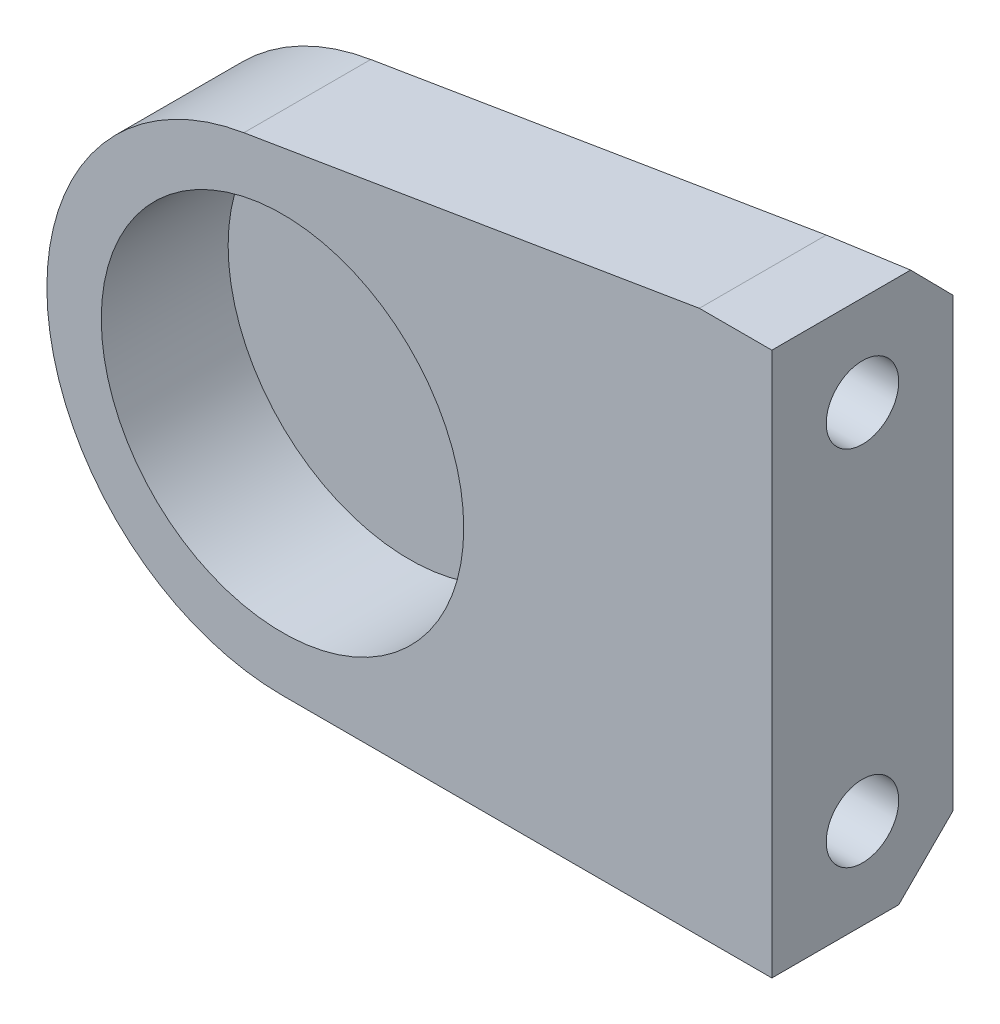
ISO-10303-21;
HEADER;
FILE_DESCRIPTION(('STEP AP214'),'2;1');
FILE_NAME('part.step','',(''),(''),'','','');
FILE_SCHEMA(('AUTOMOTIVE_DESIGN { 1 0 10303 214 1 1 1 1 }'));
ENDSEC;
DATA;
#1=APPLICATION_CONTEXT('core data for automotive mechanical design processes');
#2=APPLICATION_PROTOCOL_DEFINITION('international standard','automotive_design',2000,#1);
#3=PRODUCT_CONTEXT('',#1,'mechanical');
#4=PRODUCT('Part','Part','',(#3));
#5=PRODUCT_RELATED_PRODUCT_CATEGORY('part','',(#4));
#6=PRODUCT_DEFINITION_FORMATION('','',#4);
#7=PRODUCT_DEFINITION_CONTEXT('part definition',#1,'design');
#8=PRODUCT_DEFINITION('design','',#6,#7);
#9=PRODUCT_DEFINITION_SHAPE('','',#8);
#10=(LENGTH_UNIT() NAMED_UNIT(*) SI_UNIT(.MILLI.,.METRE.));
#11=(NAMED_UNIT(*) PLANE_ANGLE_UNIT() SI_UNIT($,.RADIAN.));
#12=(NAMED_UNIT(*) SI_UNIT($,.STERADIAN.) SOLID_ANGLE_UNIT());
#13=UNCERTAINTY_MEASURE_WITH_UNIT(LENGTH_MEASURE(1.E-05),#10,'distance_accuracy_value','');
#14=(GEOMETRIC_REPRESENTATION_CONTEXT(3) GLOBAL_UNCERTAINTY_ASSIGNED_CONTEXT((#13)) GLOBAL_UNIT_ASSIGNED_CONTEXT((#10,
#11,#12)) REPRESENTATION_CONTEXT('',''));
#15=CARTESIAN_POINT('',(0.,0.,0.));
#16=DIRECTION('',(0.,0.,1.));
#17=DIRECTION('',(1.,0.,0.));
#18=AXIS2_PLACEMENT_3D('',#15,#16,#17);
#19=CARTESIAN_POINT('',(0.,0.,5.));
#20=DIRECTION('',(0.,0.,-1.));
#21=DIRECTION('',(-1.,0.,0.));
#22=AXIS2_PLACEMENT_3D('',#19,#20,#21);
#23=CYLINDRICAL_SURFACE('',#22,6.5);
#24=DIRECTION('',(0.,0.,-1.));
#25=VECTOR('',#24,1.);
#26=CARTESIAN_POINT('',(-1.06545276752004,6.41208315605653,5.));
#27=LINE('',#26,#25);
#28=CARTESIAN_POINT('',(-1.06545276752004,6.41208315605653,5.));
#29=VERTEX_POINT('',#28);
#30=CARTESIAN_POINT('',(-1.06545276752004,6.41208315605653,1.5));
#31=VERTEX_POINT('',#30);
#32=EDGE_CURVE('E162',#29,#31,#27,.T.);
#33=ORIENTED_EDGE('',*,*,#32,.T.);
#34=CARTESIAN_POINT('',(0.,0.,1.5));
#35=DIRECTION('',(0.,0.,-1.));
#36=DIRECTION('',(-1.,0.,0.));
#37=AXIS2_PLACEMENT_3D('',#34,#35,#36);
#38=CIRCLE('',#37,6.5);
#39=CARTESIAN_POINT('',(0.,-6.5,1.5));
#40=VERTEX_POINT('',#39);
#41=EDGE_CURVE('E42',#31,#40,#38,.F.);
#42=ORIENTED_EDGE('',*,*,#41,.T.);
#43=DIRECTION('',(0.,0.,-1.));
#44=VECTOR('',#43,1.);
#45=CARTESIAN_POINT('',(0.,-6.5,5.));
#46=LINE('',#45,#44);
#47=CARTESIAN_POINT('',(0.,-6.5,5.));
#48=VERTEX_POINT('',#47);
#49=EDGE_CURVE('E94',#48,#40,#46,.T.);
#50=ORIENTED_EDGE('',*,*,#49,.F.);
#51=CARTESIAN_POINT('',(0.,0.,5.));
#52=DIRECTION('',(0.,0.,1.));
#53=DIRECTION('',(-1.,0.,0.));
#54=AXIS2_PLACEMENT_3D('',#51,#52,#53);
#55=CIRCLE('',#54,6.5);
#56=EDGE_CURVE('E99',#29,#48,#55,.T.);
#57=ORIENTED_EDGE('',*,*,#56,.F.);
#58=EDGE_LOOP('',(#33,#42,#50,#57));
#59=FACE_BOUND('',#58,.T.);
#60=ADVANCED_FACE('F33',(#59),#23,.T.);
#61=CARTESIAN_POINT('',(0.,-6.5,5.));
#62=DIRECTION('',(0.,1.,0.));
#63=DIRECTION('',(0.,0.,1.));
#64=AXIS2_PLACEMENT_3D('',#61,#62,#63);
#65=PLANE('',#64);
#66=ORIENTED_EDGE('',*,*,#49,.T.);
#67=DIRECTION('',(1.,0.,0.));
#68=VECTOR('',#67,1.);
#69=CARTESIAN_POINT('',(13.5,-6.5,1.5));
#70=LINE('',#69,#68);
#71=CARTESIAN_POINT('',(13.5,-6.5,1.50000000000001));
#72=VERTEX_POINT('',#71);
#73=EDGE_CURVE('E11',#40,#72,#70,.T.);
#74=ORIENTED_EDGE('',*,*,#73,.T.);
#75=DIRECTION('',(0.,0.,-1.));
#76=VECTOR('',#75,1.);
#77=CARTESIAN_POINT('',(13.5,-6.5,5.));
#78=LINE('',#77,#76);
#79=CARTESIAN_POINT('',(13.5,-6.5,5.));
#80=VERTEX_POINT('',#79);
#81=EDGE_CURVE('E95',#80,#72,#78,.T.);
#82=ORIENTED_EDGE('',*,*,#81,.F.);
#83=DIRECTION('',(1.,0.,0.));
#84=VECTOR('',#83,1.);
#85=CARTESIAN_POINT('',(0.,-6.5,5.));
#86=LINE('',#85,#84);
#87=EDGE_CURVE('E91',#48,#80,#86,.T.);
#88=ORIENTED_EDGE('',*,*,#87,.F.);
#89=EDGE_LOOP('',(#66,#74,#82,#88));
#90=FACE_BOUND('',#89,.T.);
#91=ADVANCED_FACE('F93',(#90),#65,.F.);
#92=CARTESIAN_POINT('',(13.5,-6.5,5.));
#93=DIRECTION('',(-1.,0.,0.));
#94=DIRECTION('',(0.,0.,1.));
#95=AXIS2_PLACEMENT_3D('',#92,#93,#94);
#96=PLANE('',#95);
#97=CARTESIAN_POINT('',(13.5,-4.,2.5));
#98=DIRECTION('',(1.,0.,0.));
#99=DIRECTION('',(0.,0.,1.));
#100=AXIS2_PLACEMENT_3D('',#97,#98,#99);
#101=CIRCLE('',#100,1.);
#102=CARTESIAN_POINT('',(13.5,-4.,3.5));
#103=VERTEX_POINT('',#102);
#104=EDGE_CURVE('E134',#103,#103,#101,.T.);
#105=ORIENTED_EDGE('',*,*,#104,.F.);
#106=EDGE_LOOP('',(#105));
#107=FACE_BOUND('',#106,.T.);
#108=CARTESIAN_POINT('',(13.5,6.,2.5));
#109=DIRECTION('',(1.,0.,0.));
#110=DIRECTION('',(0.,0.,-1.));
#111=AXIS2_PLACEMENT_3D('',#108,#109,#110);
#112=CIRCLE('',#111,1.);
#113=CARTESIAN_POINT('',(13.5,6.,1.5));
#114=VERTEX_POINT('',#113);
#115=EDGE_CURVE('E144',#114,#114,#112,.T.);
#116=ORIENTED_EDGE('',*,*,#115,.F.);
#117=EDGE_LOOP('',(#116));
#118=FACE_BOUND('',#117,.T.);
#119=DIRECTION('',(0.,1.,0.));
#120=VECTOR('',#119,1.);
#121=CARTESIAN_POINT('',(13.5,-6.5,0.));
#122=LINE('',#121,#120);
#123=CARTESIAN_POINT('',(13.5,-4.99999999999999,0.));
#124=VERTEX_POINT('',#123);
#125=CARTESIAN_POINT('',(13.5,7.31175987903972,0.));
#126=VERTEX_POINT('',#125);
#127=EDGE_CURVE('E106',#124,#126,#122,.T.);
#128=ORIENTED_EDGE('',*,*,#127,.T.);
#129=DIRECTION('',(0.,0.711904885384779,0.702275896044628));
#130=VECTOR('',#129,1.);
#131=CARTESIAN_POINT('',(13.5,8.66390061253409,1.33385212643956));
#132=LINE('',#131,#130);
#133=CARTESIAN_POINT('',(13.5,8.5,1.17216837922461));
#134=VERTEX_POINT('',#133);
#135=EDGE_CURVE('E124',#126,#134,#132,.T.);
#136=ORIENTED_EDGE('',*,*,#135,.T.);
#137=DIRECTION('',(0.,0.,-1.));
#138=VECTOR('',#137,1.);
#139=CARTESIAN_POINT('',(13.5,8.5,5.));
#140=LINE('',#139,#138);
#141=CARTESIAN_POINT('',(13.5,8.5,5.));
#142=VERTEX_POINT('',#141);
#143=EDGE_CURVE('E113',#142,#134,#140,.T.);
#144=ORIENTED_EDGE('',*,*,#143,.F.);
#145=DIRECTION('',(0.,1.,0.));
#146=VECTOR('',#145,1.);
#147=CARTESIAN_POINT('',(13.5,-6.5,5.));
#148=LINE('',#147,#146);
#149=EDGE_CURVE('E98',#80,#142,#148,.T.);
#150=ORIENTED_EDGE('',*,*,#149,.F.);
#151=ORIENTED_EDGE('',*,*,#81,.T.);
#152=DIRECTION('',(0.,0.707106781186548,-0.707106781186547));
#153=VECTOR('',#152,1.);
#154=CARTESIAN_POINT('',(13.5,-6.5,1.5));
#155=LINE('',#154,#153);
#156=EDGE_CURVE('E122',#72,#124,#155,.T.);
#157=ORIENTED_EDGE('',*,*,#156,.T.);
#158=EDGE_LOOP('',(#128,#136,#144,#150,#151,#157));
#159=FACE_BOUND('',#158,.T.);
#160=ADVANCED_FACE('F189',(#107,#118,#159),#96,.F.);
#161=CARTESIAN_POINT('',(13.5,8.5,5.));
#162=DIRECTION('',(0.,-1.,0.));
#163=DIRECTION('',(0.,0.,-1.));
#164=AXIS2_PLACEMENT_3D('',#161,#162,#163);
#165=PLANE('',#164);
#166=ORIENTED_EDGE('',*,*,#143,.T.);
#167=DIRECTION('',(-0.986830597713905,0.,0.161757137139652));
#168=VECTOR('',#167,1.);
#169=CARTESIAN_POINT('',(11.5,8.5,1.5));
#170=LINE('',#169,#168);
#171=CARTESIAN_POINT('',(11.5,8.5,1.5));
#172=VERTEX_POINT('',#171);
#173=EDGE_CURVE('E126',#134,#172,#170,.T.);
#174=ORIENTED_EDGE('',*,*,#173,.T.);
#175=DIRECTION('',(0.,0.,-1.));
#176=VECTOR('',#175,1.);
#177=CARTESIAN_POINT('',(11.5,8.5,5.));
#178=LINE('',#177,#176);
#179=CARTESIAN_POINT('',(11.5,8.5,5.));
#180=VERTEX_POINT('',#179);
#181=EDGE_CURVE('E166',#180,#172,#178,.T.);
#182=ORIENTED_EDGE('',*,*,#181,.F.);
#183=DIRECTION('',(-1.,0.,0.));
#184=VECTOR('',#183,1.);
#185=CARTESIAN_POINT('',(13.5,8.5,5.));
#186=LINE('',#185,#184);
#187=EDGE_CURVE('E159',#142,#180,#186,.T.);
#188=ORIENTED_EDGE('',*,*,#187,.F.);
#189=EDGE_LOOP('',(#166,#174,#182,#188));
#190=FACE_BOUND('',#189,.T.);
#191=ADVANCED_FACE('F173',(#190),#165,.F.);
#192=CARTESIAN_POINT('',(11.5,8.5,5.));
#193=DIRECTION('',(0.163915810387699,-0.986474331701005,0.));
#194=DIRECTION('',(0.986474331701005,0.163915810387699,0.));
#195=AXIS2_PLACEMENT_3D('',#192,#193,#194);
#196=PLANE('',#195);
#197=ORIENTED_EDGE('',*,*,#181,.T.);
#198=DIRECTION('',(-0.986474331701005,-0.163915810387699,0.));
#199=VECTOR('',#198,1.);
#200=CARTESIAN_POINT('',(-1.06545276752004,6.41208315605653,1.50000000000001));
#201=LINE('',#200,#199);
#202=EDGE_CURVE('E108',#172,#31,#201,.T.);
#203=ORIENTED_EDGE('',*,*,#202,.T.);
#204=ORIENTED_EDGE('',*,*,#32,.F.);
#205=DIRECTION('',(-0.986474331701005,-0.163915810387699,0.));
#206=VECTOR('',#205,1.);
#207=CARTESIAN_POINT('',(11.5,8.5,5.));
#208=LINE('',#207,#206);
#209=EDGE_CURVE('E104',#180,#29,#208,.T.);
#210=ORIENTED_EDGE('',*,*,#209,.F.);
#211=EDGE_LOOP('',(#197,#203,#204,#210));
#212=FACE_BOUND('',#211,.T.);
#213=ADVANCED_FACE('F179',(#212),#196,.F.);
#214=CARTESIAN_POINT('',(0.,0.,5.));
#215=DIRECTION('',(0.,0.,-1.));
#216=DIRECTION('',(-1.,0.,0.));
#217=AXIS2_PLACEMENT_3D('',#214,#215,#216);
#218=PLANE('',#217);
#219=CARTESIAN_POINT('',(0.,0.,5.));
#220=DIRECTION('',(0.,0.,1.));
#221=DIRECTION('',(1.,0.,0.));
#222=AXIS2_PLACEMENT_3D('',#219,#220,#221);
#223=CIRCLE('',#222,5.);
#224=CARTESIAN_POINT('',(5.,0.,5.));
#225=VERTEX_POINT('',#224);
#226=EDGE_CURVE('E150',#225,#225,#223,.T.);
#227=ORIENTED_EDGE('',*,*,#226,.F.);
#228=EDGE_LOOP('',(#227));
#229=FACE_BOUND('',#228,.T.);
#230=ORIENTED_EDGE('',*,*,#56,.T.);
#231=ORIENTED_EDGE('',*,*,#87,.T.);
#232=ORIENTED_EDGE('',*,*,#149,.T.);
#233=ORIENTED_EDGE('',*,*,#187,.T.);
#234=ORIENTED_EDGE('',*,*,#209,.T.);
#235=EDGE_LOOP('',(#230,#231,#232,#233,#234));
#236=FACE_BOUND('',#235,.T.);
#237=ADVANCED_FACE('F102',(#229,#236),#218,.F.);
#238=CARTESIAN_POINT('',(0.,0.,0.));
#239=DIRECTION('',(0.,0.,-1.));
#240=DIRECTION('',(-1.,0.,0.));
#241=AXIS2_PLACEMENT_3D('',#238,#239,#240);
#242=PLANE('',#241);
#243=CARTESIAN_POINT('',(0.,0.,0.));
#244=DIRECTION('',(0.,0.,-1.));
#245=DIRECTION('',(-1.,0.,0.));
#246=AXIS2_PLACEMENT_3D('',#243,#244,#245);
#247=CIRCLE('',#246,4.99999999999999);
#248=CARTESIAN_POINT('',(0.,-4.99999999999999,0.));
#249=VERTEX_POINT('',#248);
#250=CARTESIAN_POINT('',(-0.819579051938495,4.93237165850501,0.));
#251=VERTEX_POINT('',#250);
#252=EDGE_CURVE('E118',#249,#251,#247,.T.);
#253=ORIENTED_EDGE('',*,*,#252,.T.);
#254=DIRECTION('',(0.986474331701005,0.163915810387699,0.));
#255=VECTOR('',#254,1.);
#256=CARTESIAN_POINT('',(11.7458737155816,7.02028850244849,0.));
#257=LINE('',#256,#255);
#258=EDGE_CURVE('E120',#251,#126,#257,.T.);
#259=ORIENTED_EDGE('',*,*,#258,.T.);
#260=ORIENTED_EDGE('',*,*,#127,.F.);
#261=DIRECTION('',(-1.,0.,0.));
#262=VECTOR('',#261,1.);
#263=CARTESIAN_POINT('',(0.,-4.99999999999999,0.));
#264=LINE('',#263,#262);
#265=EDGE_CURVE('E111',#124,#249,#264,.T.);
#266=ORIENTED_EDGE('',*,*,#265,.T.);
#267=EDGE_LOOP('',(#253,#259,#260,#266));
#268=FACE_BOUND('',#267,.T.);
#269=ADVANCED_FACE('F186',(#268),#242,.T.);
#270=CARTESIAN_POINT('',(0.,0.,1.5));
#271=DIRECTION('',(0.,0.,1.));
#272=DIRECTION('',(1.,0.,0.));
#273=AXIS2_PLACEMENT_3D('',#270,#271,#272);
#274=CYLINDRICAL_SURFACE('',#273,5.);
#275=CARTESIAN_POINT('',(0.,0.,1.5));
#276=DIRECTION('',(0.,0.,1.));
#277=DIRECTION('',(1.,0.,0.));
#278=AXIS2_PLACEMENT_3D('',#275,#276,#277);
#279=CIRCLE('',#278,5.);
#280=CARTESIAN_POINT('',(5.,0.,1.5));
#281=VERTEX_POINT('',#280);
#282=EDGE_CURVE('E153',#281,#281,#279,.T.);
#283=ORIENTED_EDGE('',*,*,#282,.F.);
#284=EDGE_LOOP('',(#283));
#285=FACE_BOUND('',#284,.T.);
#286=ORIENTED_EDGE('',*,*,#226,.T.);
#287=EDGE_LOOP('',(#286));
#288=FACE_BOUND('',#287,.T.);
#289=ADVANCED_FACE('F219',(#285,#288),#274,.F.);
#290=CARTESIAN_POINT('',(0.,0.,1.5));
#291=DIRECTION('',(0.,0.,1.));
#292=DIRECTION('',(1.,0.,0.));
#293=AXIS2_PLACEMENT_3D('',#290,#291,#292);
#294=PLANE('',#293);
#295=ORIENTED_EDGE('',*,*,#282,.T.);
#296=EDGE_LOOP('',(#295));
#297=FACE_BOUND('',#296,.T.);
#298=ADVANCED_FACE('F223',(#297),#294,.T.);
#299=CARTESIAN_POINT('',(11.5,6.,2.5));
#300=DIRECTION('',(1.,0.,0.));
#301=DIRECTION('',(0.,0.,-1.));
#302=AXIS2_PLACEMENT_3D('',#299,#300,#301);
#303=CYLINDRICAL_SURFACE('',#302,1.);
#304=CARTESIAN_POINT('',(11.5,6.,2.5));
#305=DIRECTION('',(1.,0.,0.));
#306=DIRECTION('',(0.,0.,-1.));
#307=AXIS2_PLACEMENT_3D('',#304,#305,#306);
#308=CIRCLE('',#307,1.);
#309=CARTESIAN_POINT('',(11.5,6.,1.5));
#310=VERTEX_POINT('',#309);
#311=EDGE_CURVE('E147',#310,#310,#308,.T.);
#312=ORIENTED_EDGE('',*,*,#311,.F.);
#313=EDGE_LOOP('',(#312));
#314=FACE_BOUND('',#313,.T.);
#315=ORIENTED_EDGE('',*,*,#115,.T.);
#316=EDGE_LOOP('',(#315));
#317=FACE_BOUND('',#316,.T.);
#318=ADVANCED_FACE('F229',(#314,#317),#303,.F.);
#319=CARTESIAN_POINT('',(11.5,6.,2.5));
#320=DIRECTION('',(1.,0.,0.));
#321=DIRECTION('',(0.,0.,-1.));
#322=AXIS2_PLACEMENT_3D('',#319,#320,#321);
#323=PLANE('',#322);
#324=ORIENTED_EDGE('',*,*,#311,.T.);
#325=EDGE_LOOP('',(#324));
#326=FACE_BOUND('',#325,.T.);
#327=ADVANCED_FACE('F233',(#326),#323,.T.);
#328=CARTESIAN_POINT('',(11.5,-4.,2.5));
#329=DIRECTION('',(1.,0.,0.));
#330=DIRECTION('',(0.,0.,-1.));
#331=AXIS2_PLACEMENT_3D('',#328,#329,#330);
#332=CYLINDRICAL_SURFACE('',#331,1.);
#333=CARTESIAN_POINT('',(11.5,-4.,2.5));
#334=DIRECTION('',(1.,0.,0.));
#335=DIRECTION('',(0.,0.,1.));
#336=AXIS2_PLACEMENT_3D('',#333,#334,#335);
#337=CIRCLE('',#336,1.);
#338=CARTESIAN_POINT('',(11.5,-4.,3.5));
#339=VERTEX_POINT('',#338);
#340=EDGE_CURVE('E139',#339,#339,#337,.T.);
#341=ORIENTED_EDGE('',*,*,#340,.F.);
#342=EDGE_LOOP('',(#341));
#343=FACE_BOUND('',#342,.T.);
#344=ORIENTED_EDGE('',*,*,#104,.T.);
#345=EDGE_LOOP('',(#344));
#346=FACE_BOUND('',#345,.T.);
#347=ADVANCED_FACE('F211',(#343,#346),#332,.F.);
#348=CARTESIAN_POINT('',(11.5,-4.,2.5));
#349=DIRECTION('',(-1.,0.,0.));
#350=DIRECTION('',(0.,0.,1.));
#351=AXIS2_PLACEMENT_3D('',#348,#349,#350);
#352=PLANE('',#351);
#353=ORIENTED_EDGE('',*,*,#340,.T.);
#354=EDGE_LOOP('',(#353));
#355=FACE_BOUND('',#354,.T.);
#356=ADVANCED_FACE('F206',(#355),#352,.F.);
#357=CARTESIAN_POINT('',(0.,-6.5,1.5));
#358=DIRECTION('',(0.,-0.707106781186547,-0.707106781186548));
#359=DIRECTION('',(0.,0.707106781186548,-0.707106781186547));
#360=AXIS2_PLACEMENT_3D('',#357,#358,#359);
#361=PLANE('',#360);
#362=ORIENTED_EDGE('',*,*,#156,.F.);
#363=ORIENTED_EDGE('',*,*,#73,.F.);
#364=DIRECTION('',(0.,-0.707106781186548,0.707106781186547));
#365=VECTOR('',#364,1.);
#366=CARTESIAN_POINT('',(0.,-4.99999999999999,0.));
#367=LINE('',#366,#365);
#368=EDGE_CURVE('E37',#249,#40,#367,.T.);
#369=ORIENTED_EDGE('',*,*,#368,.F.);
#370=ORIENTED_EDGE('',*,*,#265,.F.);
#371=EDGE_LOOP('',(#362,#363,#369,#370));
#372=FACE_BOUND('',#371,.T.);
#373=ADVANCED_FACE('F35',(#372),#361,.T.);
#374=CARTESIAN_POINT('',(0.,0.,1.5));
#375=DIRECTION('',(0.,0.,1.));
#376=DIRECTION('',(1.,0.,0.));
#377=AXIS2_PLACEMENT_3D('',#374,#375,#376);
#378=CONICAL_SURFACE('',#377,6.5,0.78539816339745);
#379=ORIENTED_EDGE('',*,*,#368,.T.);
#380=ORIENTED_EDGE('',*,*,#41,.F.);
#381=DIRECTION('',(-0.115905981068831,0.697542689412249,0.707106781186547));
#382=VECTOR('',#381,1.);
#383=CARTESIAN_POINT('',(-0.819579051938495,4.93237165850501,0.));
#384=LINE('',#383,#382);
#385=EDGE_CURVE('E128',#251,#31,#384,.T.);
#386=ORIENTED_EDGE('',*,*,#385,.F.);
#387=ORIENTED_EDGE('',*,*,#252,.F.);
#388=EDGE_LOOP('',(#379,#380,#386,#387));
#389=FACE_BOUND('',#388,.T.);
#390=ADVANCED_FACE('F201',(#389),#378,.T.);
#391=CARTESIAN_POINT('',(11.5,8.5,1.5));
#392=DIRECTION('',(-0.11590598106883,0.697542689412247,-0.707106781186548));
#393=DIRECTION('',(0.,0.711904885384779,0.702275896044628));
#394=AXIS2_PLACEMENT_3D('',#391,#392,#393);
#395=PLANE('',#394);
#396=ORIENTED_EDGE('',*,*,#135,.F.);
#397=ORIENTED_EDGE('',*,*,#258,.F.);
#398=ORIENTED_EDGE('',*,*,#385,.T.);
#399=ORIENTED_EDGE('',*,*,#202,.F.);
#400=ORIENTED_EDGE('',*,*,#173,.F.);
#401=EDGE_LOOP('',(#396,#397,#398,#399,#400));
#402=FACE_BOUND('',#401,.T.);
#403=ADVANCED_FACE('F177',(#402),#395,.T.);
#404=CLOSED_SHELL('',(#60,#91,#160,#191,#213,#237,#269,#289,#298,#318,#327,#347,#356,#373,#390,#403));
#405=MANIFOLD_SOLID_BREP('B2',#404);
#406=ADVANCED_BREP_SHAPE_REPRESENTATION('',(#18,#405),#14);
#407=SHAPE_DEFINITION_REPRESENTATION(#9,#406);
ENDSEC;
END-ISO-10303-21;
